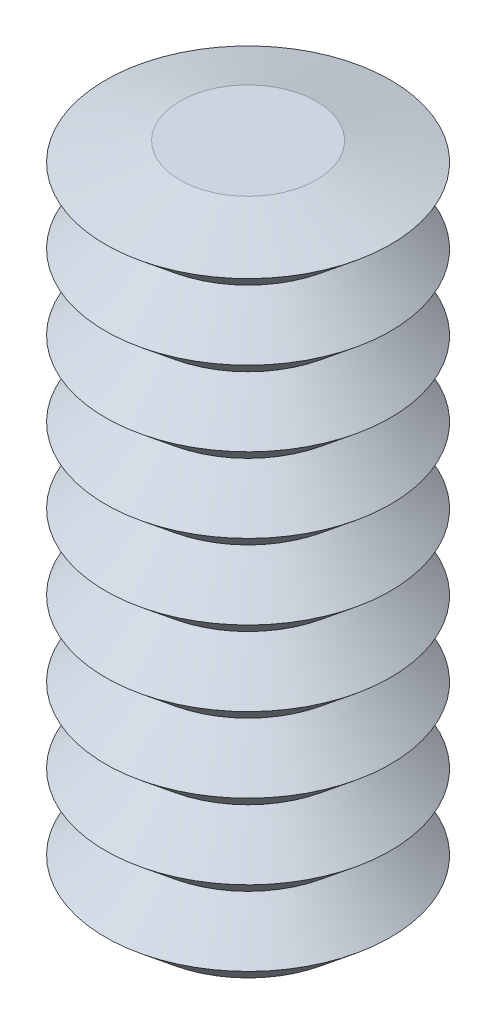
ISO-10303-21;
HEADER;
FILE_DESCRIPTION(('STEP AP214'),'2;1');
FILE_NAME('part.step','',(''),(''),'','','');
FILE_SCHEMA(('AUTOMOTIVE_DESIGN { 1 0 10303 214 1 1 1 1 }'));
ENDSEC;
DATA;
#1=APPLICATION_CONTEXT('core data for automotive mechanical design processes');
#2=APPLICATION_PROTOCOL_DEFINITION('international standard','automotive_design',2000,#1);
#3=PRODUCT_CONTEXT('',#1,'mechanical');
#4=PRODUCT('Part','Part','',(#3));
#5=PRODUCT_RELATED_PRODUCT_CATEGORY('part','',(#4));
#6=PRODUCT_DEFINITION_FORMATION('','',#4);
#7=PRODUCT_DEFINITION_CONTEXT('part definition',#1,'design');
#8=PRODUCT_DEFINITION('design','',#6,#7);
#9=PRODUCT_DEFINITION_SHAPE('','',#8);
#10=(LENGTH_UNIT() NAMED_UNIT(*) SI_UNIT(.MILLI.,.METRE.));
#11=(NAMED_UNIT(*) PLANE_ANGLE_UNIT() SI_UNIT($,.RADIAN.));
#12=(NAMED_UNIT(*) SI_UNIT($,.STERADIAN.) SOLID_ANGLE_UNIT());
#13=UNCERTAINTY_MEASURE_WITH_UNIT(LENGTH_MEASURE(1.E-05),#10,'distance_accuracy_value','');
#14=(GEOMETRIC_REPRESENTATION_CONTEXT(3) GLOBAL_UNCERTAINTY_ASSIGNED_CONTEXT((#13)) GLOBAL_UNIT_ASSIGNED_CONTEXT((#10,
#11,#12)) REPRESENTATION_CONTEXT('',''));
#15=CARTESIAN_POINT('',(0.,0.,0.));
#16=DIRECTION('',(0.,0.,1.));
#17=DIRECTION('',(1.,0.,0.));
#18=AXIS2_PLACEMENT_3D('',#15,#16,#17);
#19=CARTESIAN_POINT('',(0.,0.,0.));
#20=DIRECTION('',(0.,1.,0.));
#21=DIRECTION('',(0.,0.,1.));
#22=AXIS2_PLACEMENT_3D('',#19,#20,#21);
#23=PLANE('',#22);
#24=CARTESIAN_POINT('',(0.,0.,0.));
#25=DIRECTION('',(0.,-1.,0.));
#26=DIRECTION('',(0.,0.,-1.));
#27=AXIS2_PLACEMENT_3D('',#24,#25,#26);
#28=CIRCLE('',#27,1.82);
#29=CARTESIAN_POINT('',(0.,0.,-1.82));
#30=VERTEX_POINT('',#29);
#31=EDGE_CURVE('E10',#30,#30,#28,.T.);
#32=ORIENTED_EDGE('',*,*,#31,.F.);
#33=EDGE_LOOP('',(#32));
#34=FACE_BOUND('',#33,.T.);
#35=ADVANCED_FACE('F31',(#34),#23,.T.);
#36=CARTESIAN_POINT('',(0.,-0.5,0.));
#37=DIRECTION('',(0.,-1.,0.));
#38=DIRECTION('',(0.,0.,-1.));
#39=AXIS2_PLACEMENT_3D('',#36,#37,#38);
#40=CONICAL_SURFACE('',#39,3.8,1.32344237122307);
#41=ORIENTED_EDGE('',*,*,#31,.T.);
#42=EDGE_LOOP('',(#41));
#43=FACE_BOUND('',#42,.T.);
#44=CARTESIAN_POINT('',(0.,-0.5,0.));
#45=DIRECTION('',(0.,-1.,0.));
#46=DIRECTION('',(0.,0.,-1.));
#47=AXIS2_PLACEMENT_3D('',#44,#45,#46);
#48=CIRCLE('',#47,3.8);
#49=CARTESIAN_POINT('',(0.,-0.5,-3.8));
#50=VERTEX_POINT('',#49);
#51=EDGE_CURVE('E37',#50,#50,#48,.T.);
#52=ORIENTED_EDGE('',*,*,#51,.F.);
#53=EDGE_LOOP('',(#52));
#54=FACE_BOUND('',#53,.T.);
#55=ADVANCED_FACE('F115',(#43,#54),#40,.T.);
#56=CARTESIAN_POINT('',(0.,-1.5,0.));
#57=DIRECTION('',(0.,1.,0.));
#58=DIRECTION('',(0.,0.,1.));
#59=AXIS2_PLACEMENT_3D('',#56,#57,#58);
#60=CONICAL_SURFACE('',#59,2.6,0.876058050598193);
#61=ORIENTED_EDGE('',*,*,#51,.T.);
#62=EDGE_LOOP('',(#61));
#63=FACE_BOUND('',#62,.T.);
#64=CARTESIAN_POINT('',(0.,-1.5,0.));
#65=DIRECTION('',(0.,-1.,0.));
#66=DIRECTION('',(0.,0.,-1.));
#67=AXIS2_PLACEMENT_3D('',#64,#65,#66);
#68=CIRCLE('',#67,2.6);
#69=CARTESIAN_POINT('',(0.,-1.5,-2.6));
#70=VERTEX_POINT('',#69);
#71=EDGE_CURVE('E41',#70,#70,#68,.T.);
#72=ORIENTED_EDGE('',*,*,#71,.F.);
#73=EDGE_LOOP('',(#72));
#74=FACE_BOUND('',#73,.T.);
#75=ADVANCED_FACE('F120',(#63,#74),#60,.T.);
#76=CARTESIAN_POINT('',(0.,-2.5,0.));
#77=DIRECTION('',(0.,-1.,0.));
#78=DIRECTION('',(0.,0.,-1.));
#79=AXIS2_PLACEMENT_3D('',#76,#77,#78);
#80=CONICAL_SURFACE('',#79,3.8,0.876058050598195);
#81=ORIENTED_EDGE('',*,*,#71,.T.);
#82=EDGE_LOOP('',(#81));
#83=FACE_BOUND('',#82,.T.);
#84=CARTESIAN_POINT('',(0.,-2.5,0.));
#85=DIRECTION('',(0.,-1.,0.));
#86=DIRECTION('',(0.,0.,-1.));
#87=AXIS2_PLACEMENT_3D('',#84,#85,#86);
#88=CIRCLE('',#87,3.8);
#89=CARTESIAN_POINT('',(0.,-2.5,-3.8));
#90=VERTEX_POINT('',#89);
#91=EDGE_CURVE('E45',#90,#90,#88,.T.);
#92=ORIENTED_EDGE('',*,*,#91,.F.);
#93=EDGE_LOOP('',(#92));
#94=FACE_BOUND('',#93,.T.);
#95=ADVANCED_FACE('F124',(#83,#94),#80,.T.);
#96=CARTESIAN_POINT('',(0.,-3.5,0.));
#97=DIRECTION('',(0.,1.,0.));
#98=DIRECTION('',(0.,0.,1.));
#99=AXIS2_PLACEMENT_3D('',#96,#97,#98);
#100=CONICAL_SURFACE('',#99,2.6,0.876058050598193);
#101=ORIENTED_EDGE('',*,*,#91,.T.);
#102=EDGE_LOOP('',(#101));
#103=FACE_BOUND('',#102,.T.);
#104=CARTESIAN_POINT('',(0.,-3.5,0.));
#105=DIRECTION('',(0.,-1.,0.));
#106=DIRECTION('',(0.,0.,-1.));
#107=AXIS2_PLACEMENT_3D('',#104,#105,#106);
#108=CIRCLE('',#107,2.6);
#109=CARTESIAN_POINT('',(0.,-3.5,-2.6));
#110=VERTEX_POINT('',#109);
#111=EDGE_CURVE('E50',#110,#110,#108,.T.);
#112=ORIENTED_EDGE('',*,*,#111,.F.);
#113=EDGE_LOOP('',(#112));
#114=FACE_BOUND('',#113,.T.);
#115=ADVANCED_FACE('F130',(#103,#114),#100,.T.);
#116=CARTESIAN_POINT('',(0.,-4.5,0.));
#117=DIRECTION('',(0.,-1.,0.));
#118=DIRECTION('',(0.,0.,-1.));
#119=AXIS2_PLACEMENT_3D('',#116,#117,#118);
#120=CONICAL_SURFACE('',#119,3.8,0.876058050598193);
#121=ORIENTED_EDGE('',*,*,#111,.T.);
#122=EDGE_LOOP('',(#121));
#123=FACE_BOUND('',#122,.T.);
#124=CARTESIAN_POINT('',(0.,-4.5,0.));
#125=DIRECTION('',(0.,-1.,0.));
#126=DIRECTION('',(0.,0.,-1.));
#127=AXIS2_PLACEMENT_3D('',#124,#125,#126);
#128=CIRCLE('',#127,3.8);
#129=CARTESIAN_POINT('',(0.,-4.5,-3.8));
#130=VERTEX_POINT('',#129);
#131=EDGE_CURVE('E53',#130,#130,#128,.T.);
#132=ORIENTED_EDGE('',*,*,#131,.F.);
#133=EDGE_LOOP('',(#132));
#134=FACE_BOUND('',#133,.T.);
#135=ADVANCED_FACE('F134',(#123,#134),#120,.T.);
#136=CARTESIAN_POINT('',(0.,-5.5,0.));
#137=DIRECTION('',(0.,1.,0.));
#138=DIRECTION('',(0.,0.,1.));
#139=AXIS2_PLACEMENT_3D('',#136,#137,#138);
#140=CONICAL_SURFACE('',#139,2.6,0.876058050598195);
#141=ORIENTED_EDGE('',*,*,#131,.T.);
#142=EDGE_LOOP('',(#141));
#143=FACE_BOUND('',#142,.T.);
#144=CARTESIAN_POINT('',(0.,-5.5,0.));
#145=DIRECTION('',(0.,-1.,0.));
#146=DIRECTION('',(0.,0.,-1.));
#147=AXIS2_PLACEMENT_3D('',#144,#145,#146);
#148=CIRCLE('',#147,2.6);
#149=CARTESIAN_POINT('',(0.,-5.5,-2.6));
#150=VERTEX_POINT('',#149);
#151=EDGE_CURVE('E56',#150,#150,#148,.T.);
#152=ORIENTED_EDGE('',*,*,#151,.F.);
#153=EDGE_LOOP('',(#152));
#154=FACE_BOUND('',#153,.T.);
#155=ADVANCED_FACE('F138',(#143,#154),#140,.T.);
#156=CARTESIAN_POINT('',(0.,-6.5,0.));
#157=DIRECTION('',(0.,-1.,0.));
#158=DIRECTION('',(0.,0.,-1.));
#159=AXIS2_PLACEMENT_3D('',#156,#157,#158);
#160=CONICAL_SURFACE('',#159,3.8,0.876058050598192);
#161=ORIENTED_EDGE('',*,*,#151,.T.);
#162=EDGE_LOOP('',(#161));
#163=FACE_BOUND('',#162,.T.);
#164=CARTESIAN_POINT('',(0.,-6.5,0.));
#165=DIRECTION('',(0.,-1.,0.));
#166=DIRECTION('',(0.,0.,-1.));
#167=AXIS2_PLACEMENT_3D('',#164,#165,#166);
#168=CIRCLE('',#167,3.8);
#169=CARTESIAN_POINT('',(0.,-6.5,-3.8));
#170=VERTEX_POINT('',#169);
#171=EDGE_CURVE('E59',#170,#170,#168,.T.);
#172=ORIENTED_EDGE('',*,*,#171,.F.);
#173=EDGE_LOOP('',(#172));
#174=FACE_BOUND('',#173,.T.);
#175=ADVANCED_FACE('F142',(#163,#174),#160,.T.);
#176=CARTESIAN_POINT('',(0.,-7.5,0.));
#177=DIRECTION('',(0.,1.,0.));
#178=DIRECTION('',(0.,0.,1.));
#179=AXIS2_PLACEMENT_3D('',#176,#177,#178);
#180=CONICAL_SURFACE('',#179,2.6,0.876058050598194);
#181=ORIENTED_EDGE('',*,*,#171,.T.);
#182=EDGE_LOOP('',(#181));
#183=FACE_BOUND('',#182,.T.);
#184=CARTESIAN_POINT('',(0.,-7.5,0.));
#185=DIRECTION('',(0.,-1.,0.));
#186=DIRECTION('',(0.,0.,-1.));
#187=AXIS2_PLACEMENT_3D('',#184,#185,#186);
#188=CIRCLE('',#187,2.6);
#189=CARTESIAN_POINT('',(0.,-7.5,-2.6));
#190=VERTEX_POINT('',#189);
#191=EDGE_CURVE('E62',#190,#190,#188,.T.);
#192=ORIENTED_EDGE('',*,*,#191,.F.);
#193=EDGE_LOOP('',(#192));
#194=FACE_BOUND('',#193,.T.);
#195=ADVANCED_FACE('F146',(#183,#194),#180,.T.);
#196=CARTESIAN_POINT('',(0.,-8.5,0.));
#197=DIRECTION('',(0.,-1.,0.));
#198=DIRECTION('',(0.,0.,-1.));
#199=AXIS2_PLACEMENT_3D('',#196,#197,#198);
#200=CONICAL_SURFACE('',#199,3.8,0.876058050598193);
#201=ORIENTED_EDGE('',*,*,#191,.T.);
#202=EDGE_LOOP('',(#201));
#203=FACE_BOUND('',#202,.T.);
#204=CARTESIAN_POINT('',(0.,-8.5,0.));
#205=DIRECTION('',(0.,-1.,0.));
#206=DIRECTION('',(0.,0.,-1.));
#207=AXIS2_PLACEMENT_3D('',#204,#205,#206);
#208=CIRCLE('',#207,3.8);
#209=CARTESIAN_POINT('',(0.,-8.5,-3.8));
#210=VERTEX_POINT('',#209);
#211=EDGE_CURVE('E65',#210,#210,#208,.T.);
#212=ORIENTED_EDGE('',*,*,#211,.F.);
#213=EDGE_LOOP('',(#212));
#214=FACE_BOUND('',#213,.T.);
#215=ADVANCED_FACE('F150',(#203,#214),#200,.T.);
#216=CARTESIAN_POINT('',(0.,-9.5,0.));
#217=DIRECTION('',(0.,1.,0.));
#218=DIRECTION('',(0.,0.,1.));
#219=AXIS2_PLACEMENT_3D('',#216,#217,#218);
#220=CONICAL_SURFACE('',#219,2.6,0.876058050598194);
#221=ORIENTED_EDGE('',*,*,#211,.T.);
#222=EDGE_LOOP('',(#221));
#223=FACE_BOUND('',#222,.T.);
#224=CARTESIAN_POINT('',(0.,-9.5,0.));
#225=DIRECTION('',(0.,-1.,0.));
#226=DIRECTION('',(0.,0.,-1.));
#227=AXIS2_PLACEMENT_3D('',#224,#225,#226);
#228=CIRCLE('',#227,2.6);
#229=CARTESIAN_POINT('',(0.,-9.5,-2.6));
#230=VERTEX_POINT('',#229);
#231=EDGE_CURVE('E68',#230,#230,#228,.T.);
#232=ORIENTED_EDGE('',*,*,#231,.F.);
#233=EDGE_LOOP('',(#232));
#234=FACE_BOUND('',#233,.T.);
#235=ADVANCED_FACE('F154',(#223,#234),#220,.T.);
#236=CARTESIAN_POINT('',(0.,-10.5,0.));
#237=DIRECTION('',(0.,-1.,0.));
#238=DIRECTION('',(0.,0.,-1.));
#239=AXIS2_PLACEMENT_3D('',#236,#237,#238);
#240=CONICAL_SURFACE('',#239,3.8,0.876058050598193);
#241=ORIENTED_EDGE('',*,*,#231,.T.);
#242=EDGE_LOOP('',(#241));
#243=FACE_BOUND('',#242,.T.);
#244=CARTESIAN_POINT('',(0.,-10.5,0.));
#245=DIRECTION('',(0.,-1.,0.));
#246=DIRECTION('',(0.,0.,-1.));
#247=AXIS2_PLACEMENT_3D('',#244,#245,#246);
#248=CIRCLE('',#247,3.8);
#249=CARTESIAN_POINT('',(0.,-10.5,-3.8));
#250=VERTEX_POINT('',#249);
#251=EDGE_CURVE('E71',#250,#250,#248,.T.);
#252=ORIENTED_EDGE('',*,*,#251,.F.);
#253=EDGE_LOOP('',(#252));
#254=FACE_BOUND('',#253,.T.);
#255=ADVANCED_FACE('F158',(#243,#254),#240,.T.);
#256=CARTESIAN_POINT('',(0.,-11.5,0.));
#257=DIRECTION('',(0.,1.,0.));
#258=DIRECTION('',(0.,0.,1.));
#259=AXIS2_PLACEMENT_3D('',#256,#257,#258);
#260=CONICAL_SURFACE('',#259,2.6,0.876058050598194);
#261=ORIENTED_EDGE('',*,*,#251,.T.);
#262=EDGE_LOOP('',(#261));
#263=FACE_BOUND('',#262,.T.);
#264=CARTESIAN_POINT('',(0.,-11.5,0.));
#265=DIRECTION('',(0.,-1.,0.));
#266=DIRECTION('',(0.,0.,-1.));
#267=AXIS2_PLACEMENT_3D('',#264,#265,#266);
#268=CIRCLE('',#267,2.6);
#269=CARTESIAN_POINT('',(0.,-11.5,-2.6));
#270=VERTEX_POINT('',#269);
#271=EDGE_CURVE('E74',#270,#270,#268,.T.);
#272=ORIENTED_EDGE('',*,*,#271,.F.);
#273=EDGE_LOOP('',(#272));
#274=FACE_BOUND('',#273,.T.);
#275=ADVANCED_FACE('F162',(#263,#274),#260,.T.);
#276=CARTESIAN_POINT('',(0.,-12.5,0.));
#277=DIRECTION('',(0.,-1.,0.));
#278=DIRECTION('',(0.,0.,-1.));
#279=AXIS2_PLACEMENT_3D('',#276,#277,#278);
#280=CONICAL_SURFACE('',#279,3.8,0.876058050598193);
#281=ORIENTED_EDGE('',*,*,#271,.T.);
#282=EDGE_LOOP('',(#281));
#283=FACE_BOUND('',#282,.T.);
#284=CARTESIAN_POINT('',(0.,-12.5,0.));
#285=DIRECTION('',(0.,-1.,0.));
#286=DIRECTION('',(0.,0.,-1.));
#287=AXIS2_PLACEMENT_3D('',#284,#285,#286);
#288=CIRCLE('',#287,3.8);
#289=CARTESIAN_POINT('',(0.,-12.5,-3.8));
#290=VERTEX_POINT('',#289);
#291=EDGE_CURVE('E77',#290,#290,#288,.T.);
#292=ORIENTED_EDGE('',*,*,#291,.F.);
#293=EDGE_LOOP('',(#292));
#294=FACE_BOUND('',#293,.T.);
#295=ADVANCED_FACE('F166',(#283,#294),#280,.T.);
#296=CARTESIAN_POINT('',(0.,-13.5,0.));
#297=DIRECTION('',(0.,1.,0.));
#298=DIRECTION('',(0.,0.,1.));
#299=AXIS2_PLACEMENT_3D('',#296,#297,#298);
#300=CONICAL_SURFACE('',#299,2.6,0.876058050598194);
#301=ORIENTED_EDGE('',*,*,#291,.T.);
#302=EDGE_LOOP('',(#301));
#303=FACE_BOUND('',#302,.T.);
#304=CARTESIAN_POINT('',(0.,-13.5,0.));
#305=DIRECTION('',(0.,-1.,0.));
#306=DIRECTION('',(0.,0.,-1.));
#307=AXIS2_PLACEMENT_3D('',#304,#305,#306);
#308=CIRCLE('',#307,2.6);
#309=CARTESIAN_POINT('',(0.,-13.5,-2.6));
#310=VERTEX_POINT('',#309);
#311=EDGE_CURVE('E80',#310,#310,#308,.T.);
#312=ORIENTED_EDGE('',*,*,#311,.F.);
#313=EDGE_LOOP('',(#312));
#314=FACE_BOUND('',#313,.T.);
#315=ADVANCED_FACE('F170',(#303,#314),#300,.T.);
#316=CARTESIAN_POINT('',(0.,-14.5,0.));
#317=DIRECTION('',(0.,-1.,0.));
#318=DIRECTION('',(0.,0.,-1.));
#319=AXIS2_PLACEMENT_3D('',#316,#317,#318);
#320=CONICAL_SURFACE('',#319,3.8,0.876058050598193);
#321=ORIENTED_EDGE('',*,*,#311,.T.);
#322=EDGE_LOOP('',(#321));
#323=FACE_BOUND('',#322,.T.);
#324=CARTESIAN_POINT('',(0.,-14.5,0.));
#325=DIRECTION('',(0.,-1.,0.));
#326=DIRECTION('',(0.,0.,-1.));
#327=AXIS2_PLACEMENT_3D('',#324,#325,#326);
#328=CIRCLE('',#327,3.8);
#329=CARTESIAN_POINT('',(0.,-14.5,-3.8));
#330=VERTEX_POINT('',#329);
#331=EDGE_CURVE('E83',#330,#330,#328,.T.);
#332=ORIENTED_EDGE('',*,*,#331,.F.);
#333=EDGE_LOOP('',(#332));
#334=FACE_BOUND('',#333,.T.);
#335=ADVANCED_FACE('F174',(#323,#334),#320,.T.);
#336=CARTESIAN_POINT('',(0.,-15.5,0.));
#337=DIRECTION('',(0.,1.,0.));
#338=DIRECTION('',(0.,0.,1.));
#339=AXIS2_PLACEMENT_3D('',#336,#337,#338);
#340=CONICAL_SURFACE('',#339,2.6,0.876058050598194);
#341=ORIENTED_EDGE('',*,*,#331,.T.);
#342=EDGE_LOOP('',(#341));
#343=FACE_BOUND('',#342,.T.);
#344=CARTESIAN_POINT('',(0.,-15.5,0.));
#345=DIRECTION('',(0.,-1.,0.));
#346=DIRECTION('',(0.,0.,-1.));
#347=AXIS2_PLACEMENT_3D('',#344,#345,#346);
#348=CIRCLE('',#347,2.6);
#349=CARTESIAN_POINT('',(0.,-15.5,-2.6));
#350=VERTEX_POINT('',#349);
#351=EDGE_CURVE('E86',#350,#350,#348,.T.);
#352=ORIENTED_EDGE('',*,*,#351,.F.);
#353=EDGE_LOOP('',(#352));
#354=FACE_BOUND('',#353,.T.);
#355=ADVANCED_FACE('F178',(#343,#354),#340,.T.);
#356=CARTESIAN_POINT('',(0.,-16.5,0.));
#357=DIRECTION('',(0.,-1.,0.));
#358=DIRECTION('',(0.,0.,-1.));
#359=AXIS2_PLACEMENT_3D('',#356,#357,#358);
#360=CONICAL_SURFACE('',#359,3.8,0.876058050598193);
#361=ORIENTED_EDGE('',*,*,#351,.T.);
#362=EDGE_LOOP('',(#361));
#363=FACE_BOUND('',#362,.T.);
#364=CARTESIAN_POINT('',(0.,-16.5,0.));
#365=DIRECTION('',(0.,-1.,0.));
#366=DIRECTION('',(0.,0.,-1.));
#367=AXIS2_PLACEMENT_3D('',#364,#365,#366);
#368=CIRCLE('',#367,3.8);
#369=CARTESIAN_POINT('',(0.,-16.5,-3.8));
#370=VERTEX_POINT('',#369);
#371=EDGE_CURVE('E89',#370,#370,#368,.T.);
#372=ORIENTED_EDGE('',*,*,#371,.F.);
#373=EDGE_LOOP('',(#372));
#374=FACE_BOUND('',#373,.T.);
#375=ADVANCED_FACE('F111',(#363,#374),#360,.T.);
#376=CARTESIAN_POINT('',(0.,-17.5,0.));
#377=DIRECTION('',(0.,1.,0.));
#378=DIRECTION('',(0.,0.,1.));
#379=AXIS2_PLACEMENT_3D('',#376,#377,#378);
#380=CONICAL_SURFACE('',#379,2.6,0.876058050598193);
#381=ORIENTED_EDGE('',*,*,#371,.T.);
#382=EDGE_LOOP('',(#381));
#383=FACE_BOUND('',#382,.T.);
#384=CARTESIAN_POINT('',(0.,-17.5,0.));
#385=DIRECTION('',(0.,-1.,0.));
#386=DIRECTION('',(0.,0.,-1.));
#387=AXIS2_PLACEMENT_3D('',#384,#385,#386);
#388=CIRCLE('',#387,2.6);
#389=CARTESIAN_POINT('',(0.,-17.5,-2.6));
#390=VERTEX_POINT('',#389);
#391=EDGE_CURVE('E92',#390,#390,#388,.T.);
#392=ORIENTED_EDGE('',*,*,#391,.F.);
#393=EDGE_LOOP('',(#392));
#394=FACE_BOUND('',#393,.T.);
#395=ADVANCED_FACE('F103',(#383,#394),#380,.T.);
#396=CARTESIAN_POINT('',(0.,-18.,0.));
#397=DIRECTION('',(0.,1.,0.));
#398=DIRECTION('',(0.,0.,1.));
#399=AXIS2_PLACEMENT_3D('',#396,#397,#398);
#400=CONICAL_SURFACE('',#399,1.82,1.00075586309519);
#401=ORIENTED_EDGE('',*,*,#391,.T.);
#402=EDGE_LOOP('',(#401));
#403=FACE_BOUND('',#402,.T.);
#404=CARTESIAN_POINT('',(0.,-18.,0.));
#405=DIRECTION('',(0.,-1.,0.));
#406=DIRECTION('',(0.,0.,-1.));
#407=AXIS2_PLACEMENT_3D('',#404,#405,#406);
#408=CIRCLE('',#407,1.82);
#409=CARTESIAN_POINT('',(0.,-18.,-1.82));
#410=VERTEX_POINT('',#409);
#411=EDGE_CURVE('E95',#410,#410,#408,.T.);
#412=ORIENTED_EDGE('',*,*,#411,.F.);
#413=EDGE_LOOP('',(#412));
#414=FACE_BOUND('',#413,.T.);
#415=ADVANCED_FACE('F101',(#403,#414),#400,.T.);
#416=CARTESIAN_POINT('',(1.82,-18.,0.));
#417=DIRECTION('',(0.,-1.,0.));
#418=DIRECTION('',(0.,0.,-1.));
#419=AXIS2_PLACEMENT_3D('',#416,#417,#418);
#420=PLANE('',#419);
#421=ORIENTED_EDGE('',*,*,#411,.T.);
#422=EDGE_LOOP('',(#421));
#423=FACE_BOUND('',#422,.T.);
#424=ADVANCED_FACE('F99',(#423),#420,.T.);
#425=CLOSED_SHELL('',(#35,#55,#75,#95,#115,#135,#155,#175,#195,#215,#235,#255,#275,#295,#315,
#335,#355,#375,#395,#415,#424));
#426=MANIFOLD_SOLID_BREP('B2',#425);
#427=ADVANCED_BREP_SHAPE_REPRESENTATION('',(#18,#426),#14);
#428=SHAPE_DEFINITION_REPRESENTATION(#9,#427);
ENDSEC;
END-ISO-10303-21;
